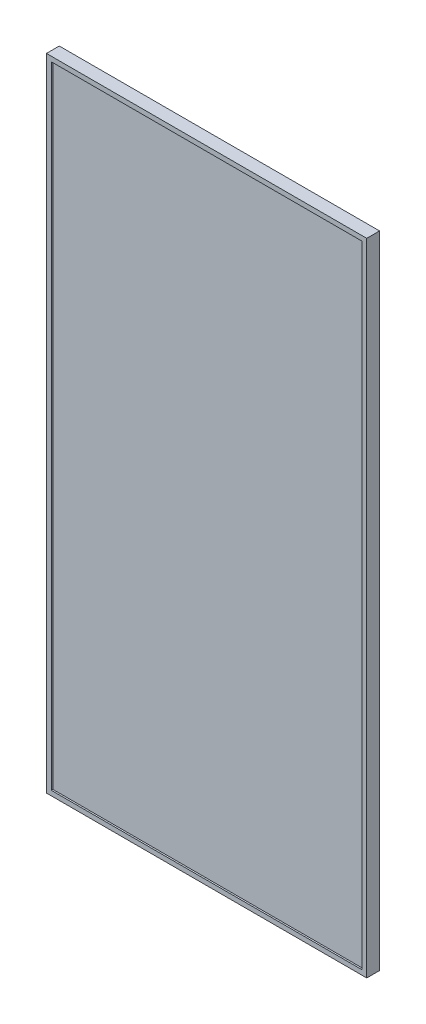
ISO-10303-21;
HEADER;
FILE_DESCRIPTION(('STEP AP214'),'2;1');
FILE_NAME('part.step','',(''),(''),'','','');
FILE_SCHEMA(('AUTOMOTIVE_DESIGN { 1 0 10303 214 1 1 1 1 }'));
ENDSEC;
DATA;
#1=APPLICATION_CONTEXT('core data for automotive mechanical design processes');
#2=APPLICATION_PROTOCOL_DEFINITION('international standard','automotive_design',2000,#1);
#3=PRODUCT_CONTEXT('',#1,'mechanical');
#4=PRODUCT('Part','Part','',(#3));
#5=PRODUCT_RELATED_PRODUCT_CATEGORY('part','',(#4));
#6=PRODUCT_DEFINITION_FORMATION('','',#4);
#7=PRODUCT_DEFINITION_CONTEXT('part definition',#1,'design');
#8=PRODUCT_DEFINITION('design','',#6,#7);
#9=PRODUCT_DEFINITION_SHAPE('','',#8);
#10=(LENGTH_UNIT() NAMED_UNIT(*) SI_UNIT(.MILLI.,.METRE.));
#11=(NAMED_UNIT(*) PLANE_ANGLE_UNIT() SI_UNIT($,.RADIAN.));
#12=(NAMED_UNIT(*) SI_UNIT($,.STERADIAN.) SOLID_ANGLE_UNIT());
#13=UNCERTAINTY_MEASURE_WITH_UNIT(LENGTH_MEASURE(1.E-05),#10,'distance_accuracy_value','');
#14=(GEOMETRIC_REPRESENTATION_CONTEXT(3) GLOBAL_UNCERTAINTY_ASSIGNED_CONTEXT((#13)) GLOBAL_UNIT_ASSIGNED_CONTEXT((#10,
#11,#12)) REPRESENTATION_CONTEXT('',''));
#15=CARTESIAN_POINT('',(0.,0.,0.));
#16=DIRECTION('',(0.,0.,1.));
#17=DIRECTION('',(1.,0.,0.));
#18=AXIS2_PLACEMENT_3D('',#15,#16,#17);
#19=CARTESIAN_POINT('',(470.,-970.,30.));
#20=DIRECTION('',(1.,0.,0.));
#21=DIRECTION('',(0.,0.,-1.));
#22=AXIS2_PLACEMENT_3D('',#19,#20,#21);
#23=PLANE('',#22);
#24=DIRECTION('',(0.,-1.,0.));
#25=VECTOR('',#24,1.);
#26=CARTESIAN_POINT('',(470.,-970.,5.));
#27=LINE('',#26,#25);
#28=CARTESIAN_POINT('',(470.,970.,5.));
#29=VERTEX_POINT('',#28);
#30=CARTESIAN_POINT('',(470.,-970.,5.));
#31=VERTEX_POINT('',#30);
#32=EDGE_CURVE('E63',#29,#31,#27,.T.);
#33=ORIENTED_EDGE('',*,*,#32,.F.);
#34=DIRECTION('',(0.,0.,-1.));
#35=VECTOR('',#34,1.);
#36=CARTESIAN_POINT('',(470.,970.,30.));
#37=LINE('',#36,#35);
#38=CARTESIAN_POINT('',(470.,970.,0.));
#39=VERTEX_POINT('',#38);
#40=EDGE_CURVE('E269',#29,#39,#37,.T.);
#41=ORIENTED_EDGE('',*,*,#40,.T.);
#42=DIRECTION('',(0.,-1.,0.));
#43=VECTOR('',#42,1.);
#44=CARTESIAN_POINT('',(470.,-970.,0.));
#45=LINE('',#44,#43);
#46=CARTESIAN_POINT('',(470.,-970.,0.));
#47=VERTEX_POINT('',#46);
#48=EDGE_CURVE('E252',#39,#47,#45,.T.);
#49=ORIENTED_EDGE('',*,*,#48,.T.);
#50=DIRECTION('',(0.,0.,-1.));
#51=VECTOR('',#50,1.);
#52=CARTESIAN_POINT('',(470.,-970.,30.));
#53=LINE('',#52,#51);
#54=EDGE_CURVE('E268',#31,#47,#53,.T.);
#55=ORIENTED_EDGE('',*,*,#54,.F.);
#56=EDGE_LOOP('',(#33,#41,#49,#55));
#57=FACE_BOUND('',#56,.T.);
#58=ADVANCED_FACE('F40',(#57),#23,.F.);
#59=CARTESIAN_POINT('',(-470.,970.,30.));
#60=DIRECTION('',(0.,1.,0.));
#61=DIRECTION('',(0.,0.,1.));
#62=AXIS2_PLACEMENT_3D('',#59,#60,#61);
#63=PLANE('',#62);
#64=DIRECTION('',(1.,0.,0.));
#65=VECTOR('',#64,1.);
#66=CARTESIAN_POINT('',(-470.,970.,5.));
#67=LINE('',#66,#65);
#68=CARTESIAN_POINT('',(-470.,970.,5.));
#69=VERTEX_POINT('',#68);
#70=EDGE_CURVE('E247',#69,#29,#67,.T.);
#71=ORIENTED_EDGE('',*,*,#70,.F.);
#72=DIRECTION('',(0.,0.,-1.));
#73=VECTOR('',#72,1.);
#74=CARTESIAN_POINT('',(-470.,970.,30.));
#75=LINE('',#74,#73);
#76=CARTESIAN_POINT('',(-470.,970.,0.));
#77=VERTEX_POINT('',#76);
#78=EDGE_CURVE('E273',#69,#77,#75,.T.);
#79=ORIENTED_EDGE('',*,*,#78,.T.);
#80=DIRECTION('',(1.,0.,0.));
#81=VECTOR('',#80,1.);
#82=CARTESIAN_POINT('',(-470.,970.,0.));
#83=LINE('',#82,#81);
#84=EDGE_CURVE('E264',#77,#39,#83,.T.);
#85=ORIENTED_EDGE('',*,*,#84,.T.);
#86=ORIENTED_EDGE('',*,*,#40,.F.);
#87=EDGE_LOOP('',(#71,#79,#85,#86));
#88=FACE_BOUND('',#87,.T.);
#89=ADVANCED_FACE('F353',(#88),#63,.F.);
#90=CARTESIAN_POINT('',(-470.,-970.,30.));
#91=DIRECTION('',(-1.,0.,0.));
#92=DIRECTION('',(0.,0.,1.));
#93=AXIS2_PLACEMENT_3D('',#90,#91,#92);
#94=PLANE('',#93);
#95=DIRECTION('',(0.,1.,0.));
#96=VECTOR('',#95,1.);
#97=CARTESIAN_POINT('',(-470.,-970.,5.));
#98=LINE('',#97,#96);
#99=CARTESIAN_POINT('',(-470.,-970.,5.));
#100=VERTEX_POINT('',#99);
#101=EDGE_CURVE('E244',#100,#69,#98,.T.);
#102=ORIENTED_EDGE('',*,*,#101,.F.);
#103=DIRECTION('',(0.,0.,-1.));
#104=VECTOR('',#103,1.);
#105=CARTESIAN_POINT('',(-470.,-970.,30.));
#106=LINE('',#105,#104);
#107=CARTESIAN_POINT('',(-470.,-970.,0.));
#108=VERTEX_POINT('',#107);
#109=EDGE_CURVE('E276',#100,#108,#106,.T.);
#110=ORIENTED_EDGE('',*,*,#109,.T.);
#111=DIRECTION('',(0.,1.,0.));
#112=VECTOR('',#111,1.);
#113=CARTESIAN_POINT('',(-470.,-970.,0.));
#114=LINE('',#113,#112);
#115=EDGE_CURVE('E260',#108,#77,#114,.T.);
#116=ORIENTED_EDGE('',*,*,#115,.T.);
#117=ORIENTED_EDGE('',*,*,#78,.F.);
#118=EDGE_LOOP('',(#102,#110,#116,#117));
#119=FACE_BOUND('',#118,.T.);
#120=ADVANCED_FACE('F358',(#119),#94,.F.);
#121=CARTESIAN_POINT('',(-470.,-970.,30.));
#122=DIRECTION('',(0.,-1.,0.));
#123=DIRECTION('',(0.,0.,-1.));
#124=AXIS2_PLACEMENT_3D('',#121,#122,#123);
#125=PLANE('',#124);
#126=DIRECTION('',(-1.,0.,0.));
#127=VECTOR('',#126,1.);
#128=CARTESIAN_POINT('',(-470.,-970.,5.));
#129=LINE('',#128,#127);
#130=EDGE_CURVE('E11',#31,#100,#129,.T.);
#131=ORIENTED_EDGE('',*,*,#130,.F.);
#132=ORIENTED_EDGE('',*,*,#54,.T.);
#133=DIRECTION('',(-1.,0.,0.));
#134=VECTOR('',#133,1.);
#135=CARTESIAN_POINT('',(-470.,-970.,0.));
#136=LINE('',#135,#134);
#137=EDGE_CURVE('E256',#47,#108,#136,.T.);
#138=ORIENTED_EDGE('',*,*,#137,.T.);
#139=ORIENTED_EDGE('',*,*,#109,.F.);
#140=EDGE_LOOP('',(#131,#132,#138,#139));
#141=FACE_BOUND('',#140,.T.);
#142=ADVANCED_FACE('F362',(#141),#125,.F.);
#143=CARTESIAN_POINT('',(-500.,1000.,40.));
#144=DIRECTION('',(1.,0.,0.));
#145=DIRECTION('',(0.,1.,0.));
#146=AXIS2_PLACEMENT_3D('',#143,#144,#145);
#147=PLANE('',#146);
#148=DIRECTION('',(0.,-1.,0.));
#149=VECTOR('',#148,1.);
#150=CARTESIAN_POINT('',(-500.,1000.,0.));
#151=LINE('',#150,#149);
#152=CARTESIAN_POINT('',(-500.,1000.,0.));
#153=VERTEX_POINT('',#152);
#154=CARTESIAN_POINT('',(-500.,-1000.,0.));
#155=VERTEX_POINT('',#154);
#156=EDGE_CURVE('E272',#153,#155,#151,.T.);
#157=ORIENTED_EDGE('',*,*,#156,.T.);
#158=DIRECTION('',(0.,0.,-1.));
#159=VECTOR('',#158,1.);
#160=CARTESIAN_POINT('',(-500.,-1000.,40.));
#161=LINE('',#160,#159);
#162=CARTESIAN_POINT('',(-500.,-1000.,40.));
#163=VERTEX_POINT('',#162);
#164=EDGE_CURVE('E49',#163,#155,#161,.T.);
#165=ORIENTED_EDGE('',*,*,#164,.F.);
#166=DIRECTION('',(0.,-1.,0.));
#167=VECTOR('',#166,1.);
#168=CARTESIAN_POINT('',(-500.,1000.,40.));
#169=LINE('',#168,#167);
#170=CARTESIAN_POINT('',(-500.,1000.,40.));
#171=VERTEX_POINT('',#170);
#172=EDGE_CURVE('E281',#171,#163,#169,.T.);
#173=ORIENTED_EDGE('',*,*,#172,.F.);
#174=DIRECTION('',(0.,0.,-1.));
#175=VECTOR('',#174,1.);
#176=CARTESIAN_POINT('',(-500.,1000.,40.));
#177=LINE('',#176,#175);
#178=EDGE_CURVE('E295',#171,#153,#177,.T.);
#179=ORIENTED_EDGE('',*,*,#178,.T.);
#180=EDGE_LOOP('',(#157,#165,#173,#179));
#181=FACE_BOUND('',#180,.T.);
#182=ADVANCED_FACE('F42',(#181),#147,.F.);
#183=CARTESIAN_POINT('',(500.,-1000.,40.));
#184=DIRECTION('',(0.,1.,0.));
#185=DIRECTION('',(-1.,0.,0.));
#186=AXIS2_PLACEMENT_3D('',#183,#184,#185);
#187=PLANE('',#186);
#188=DIRECTION('',(1.,0.,0.));
#189=VECTOR('',#188,1.);
#190=CARTESIAN_POINT('',(500.,-1000.,0.));
#191=LINE('',#190,#189);
#192=CARTESIAN_POINT('',(500.,-1000.,0.));
#193=VERTEX_POINT('',#192);
#194=EDGE_CURVE('E299',#155,#193,#191,.T.);
#195=ORIENTED_EDGE('',*,*,#194,.T.);
#196=DIRECTION('',(0.,0.,-1.));
#197=VECTOR('',#196,1.);
#198=CARTESIAN_POINT('',(500.,-1000.,40.));
#199=LINE('',#198,#197);
#200=CARTESIAN_POINT('',(500.,-1000.,40.));
#201=VERTEX_POINT('',#200);
#202=EDGE_CURVE('E314',#201,#193,#199,.T.);
#203=ORIENTED_EDGE('',*,*,#202,.F.);
#204=DIRECTION('',(1.,0.,0.));
#205=VECTOR('',#204,1.);
#206=CARTESIAN_POINT('',(500.,-1000.,40.));
#207=LINE('',#206,#205);
#208=EDGE_CURVE('E285',#163,#201,#207,.T.);
#209=ORIENTED_EDGE('',*,*,#208,.F.);
#210=ORIENTED_EDGE('',*,*,#164,.T.);
#211=EDGE_LOOP('',(#195,#203,#209,#210));
#212=FACE_BOUND('',#211,.T.);
#213=ADVANCED_FACE('F321',(#212),#187,.F.);
#214=CARTESIAN_POINT('',(500.,1000.,40.));
#215=DIRECTION('',(-1.,0.,0.));
#216=DIRECTION('',(0.,-1.,0.));
#217=AXIS2_PLACEMENT_3D('',#214,#215,#216);
#218=PLANE('',#217);
#219=DIRECTION('',(0.,1.,0.));
#220=VECTOR('',#219,1.);
#221=CARTESIAN_POINT('',(500.,1000.,0.));
#222=LINE('',#221,#220);
#223=CARTESIAN_POINT('',(500.,1000.,0.));
#224=VERTEX_POINT('',#223);
#225=EDGE_CURVE('E302',#193,#224,#222,.T.);
#226=ORIENTED_EDGE('',*,*,#225,.T.);
#227=DIRECTION('',(0.,0.,-1.));
#228=VECTOR('',#227,1.);
#229=CARTESIAN_POINT('',(500.,1000.,40.));
#230=LINE('',#229,#228);
#231=CARTESIAN_POINT('',(500.,1000.,40.));
#232=VERTEX_POINT('',#231);
#233=EDGE_CURVE('E310',#232,#224,#230,.T.);
#234=ORIENTED_EDGE('',*,*,#233,.F.);
#235=DIRECTION('',(0.,1.,0.));
#236=VECTOR('',#235,1.);
#237=CARTESIAN_POINT('',(500.,1000.,40.));
#238=LINE('',#237,#236);
#239=EDGE_CURVE('E289',#201,#232,#238,.T.);
#240=ORIENTED_EDGE('',*,*,#239,.F.);
#241=ORIENTED_EDGE('',*,*,#202,.T.);
#242=EDGE_LOOP('',(#226,#234,#240,#241));
#243=FACE_BOUND('',#242,.T.);
#244=ADVANCED_FACE('F333',(#243),#218,.F.);
#245=CARTESIAN_POINT('',(500.,1000.,40.));
#246=DIRECTION('',(0.,-1.,0.));
#247=DIRECTION('',(1.,0.,0.));
#248=AXIS2_PLACEMENT_3D('',#245,#246,#247);
#249=PLANE('',#248);
#250=DIRECTION('',(-1.,0.,0.));
#251=VECTOR('',#250,1.);
#252=CARTESIAN_POINT('',(500.,1000.,0.));
#253=LINE('',#252,#251);
#254=EDGE_CURVE('E286',#224,#153,#253,.T.);
#255=ORIENTED_EDGE('',*,*,#254,.T.);
#256=ORIENTED_EDGE('',*,*,#178,.F.);
#257=DIRECTION('',(-1.,0.,0.));
#258=VECTOR('',#257,1.);
#259=CARTESIAN_POINT('',(500.,1000.,40.));
#260=LINE('',#259,#258);
#261=EDGE_CURVE('E292',#232,#171,#260,.T.);
#262=ORIENTED_EDGE('',*,*,#261,.F.);
#263=ORIENTED_EDGE('',*,*,#233,.T.);
#264=EDGE_LOOP('',(#255,#256,#262,#263));
#265=FACE_BOUND('',#264,.T.);
#266=ADVANCED_FACE('F337',(#265),#249,.F.);
#267=CARTESIAN_POINT('',(0.,0.,40.));
#268=DIRECTION('',(0.,0.,-1.));
#269=DIRECTION('',(-1.,0.,0.));
#270=AXIS2_PLACEMENT_3D('',#267,#268,#269);
#271=PLANE('',#270);
#272=DIRECTION('',(-1.,0.,0.));
#273=VECTOR('',#272,1.);
#274=CARTESIAN_POINT('',(-485.,985.,40.));
#275=LINE('',#274,#273);
#276=CARTESIAN_POINT('',(485.,985.,40.));
#277=VERTEX_POINT('',#276);
#278=CARTESIAN_POINT('',(-485.,985.,40.));
#279=VERTEX_POINT('',#278);
#280=EDGE_CURVE('E189',#277,#279,#275,.T.);
#281=ORIENTED_EDGE('',*,*,#280,.F.);
#282=DIRECTION('',(0.,1.,0.));
#283=VECTOR('',#282,1.);
#284=CARTESIAN_POINT('',(485.,-985.,40.));
#285=LINE('',#284,#283);
#286=CARTESIAN_POINT('',(485.,-985.,40.));
#287=VERTEX_POINT('',#286);
#288=EDGE_CURVE('E56',#287,#277,#285,.T.);
#289=ORIENTED_EDGE('',*,*,#288,.F.);
#290=DIRECTION('',(1.,0.,0.));
#291=VECTOR('',#290,1.);
#292=CARTESIAN_POINT('',(-485.,-985.,40.));
#293=LINE('',#292,#291);
#294=CARTESIAN_POINT('',(-485.,-985.,40.));
#295=VERTEX_POINT('',#294);
#296=EDGE_CURVE('E176',#295,#287,#293,.T.);
#297=ORIENTED_EDGE('',*,*,#296,.F.);
#298=DIRECTION('',(0.,-1.,0.));
#299=VECTOR('',#298,1.);
#300=CARTESIAN_POINT('',(-485.,-985.,40.));
#301=LINE('',#300,#299);
#302=EDGE_CURVE('E180',#279,#295,#301,.T.);
#303=ORIENTED_EDGE('',*,*,#302,.F.);
#304=EDGE_LOOP('',(#281,#289,#297,#303));
#305=FACE_BOUND('',#304,.T.);
#306=ORIENTED_EDGE('',*,*,#172,.T.);
#307=ORIENTED_EDGE('',*,*,#208,.T.);
#308=ORIENTED_EDGE('',*,*,#239,.T.);
#309=ORIENTED_EDGE('',*,*,#261,.T.);
#310=EDGE_LOOP('',(#306,#307,#308,#309));
#311=FACE_BOUND('',#310,.T.);
#312=ADVANCED_FACE('F339',(#305,#311),#271,.F.);
#313=CARTESIAN_POINT('',(0.,0.,0.));
#314=DIRECTION('',(0.,0.,-1.));
#315=DIRECTION('',(-1.,0.,0.));
#316=AXIS2_PLACEMENT_3D('',#313,#314,#315);
#317=PLANE('',#316);
#318=ORIENTED_EDGE('',*,*,#48,.F.);
#319=ORIENTED_EDGE('',*,*,#84,.F.);
#320=ORIENTED_EDGE('',*,*,#115,.F.);
#321=ORIENTED_EDGE('',*,*,#137,.F.);
#322=EDGE_LOOP('',(#318,#319,#320,#321));
#323=FACE_BOUND('',#322,.T.);
#324=ORIENTED_EDGE('',*,*,#156,.F.);
#325=ORIENTED_EDGE('',*,*,#254,.F.);
#326=ORIENTED_EDGE('',*,*,#225,.F.);
#327=ORIENTED_EDGE('',*,*,#194,.F.);
#328=EDGE_LOOP('',(#324,#325,#326,#327));
#329=FACE_BOUND('',#328,.T.);
#330=ADVANCED_FACE('F329',(#323,#329),#317,.T.);
#331=CARTESIAN_POINT('',(495.,-995.,5.));
#332=DIRECTION('',(0.,0.,1.));
#333=DIRECTION('',(1.,0.,0.));
#334=AXIS2_PLACEMENT_3D('',#331,#332,#333);
#335=PLANE('',#334);
#336=DIRECTION('',(-1.,0.,0.));
#337=VECTOR('',#336,1.);
#338=CARTESIAN_POINT('',(495.,-995.,5.));
#339=LINE('',#338,#337);
#340=CARTESIAN_POINT('',(495.,-995.,5.));
#341=VERTEX_POINT('',#340);
#342=CARTESIAN_POINT('',(-495.,-995.,5.));
#343=VERTEX_POINT('',#342);
#344=EDGE_CURVE('E241',#341,#343,#339,.T.);
#345=ORIENTED_EDGE('',*,*,#344,.F.);
#346=DIRECTION('',(0.,1.,0.));
#347=VECTOR('',#346,1.);
#348=CARTESIAN_POINT('',(495.,-995.,5.));
#349=LINE('',#348,#347);
#350=CARTESIAN_POINT('',(495.,995.,5.));
#351=VERTEX_POINT('',#350);
#352=EDGE_CURVE('E223',#341,#351,#349,.T.);
#353=ORIENTED_EDGE('',*,*,#352,.T.);
#354=DIRECTION('',(-1.,0.,0.));
#355=VECTOR('',#354,1.);
#356=CARTESIAN_POINT('',(495.,995.,5.));
#357=LINE('',#356,#355);
#358=CARTESIAN_POINT('',(-495.,995.,5.));
#359=VERTEX_POINT('',#358);
#360=EDGE_CURVE('E238',#351,#359,#357,.T.);
#361=ORIENTED_EDGE('',*,*,#360,.T.);
#362=DIRECTION('',(0.,1.,0.));
#363=VECTOR('',#362,1.);
#364=CARTESIAN_POINT('',(-495.,-995.,5.));
#365=LINE('',#364,#363);
#366=EDGE_CURVE('E207',#343,#359,#365,.T.);
#367=ORIENTED_EDGE('',*,*,#366,.F.);
#368=EDGE_LOOP('',(#345,#353,#361,#367));
#369=FACE_BOUND('',#368,.T.);
#370=ORIENTED_EDGE('',*,*,#32,.T.);
#371=ORIENTED_EDGE('',*,*,#130,.T.);
#372=ORIENTED_EDGE('',*,*,#101,.T.);
#373=ORIENTED_EDGE('',*,*,#70,.T.);
#374=EDGE_LOOP('',(#370,#371,#372,#373));
#375=FACE_BOUND('',#374,.T.);
#376=ADVANCED_FACE('F347',(#369,#375),#335,.T.);
#377=CARTESIAN_POINT('',(495.,-995.,5.));
#378=DIRECTION('',(0.,1.,0.));
#379=DIRECTION('',(0.,0.,1.));
#380=AXIS2_PLACEMENT_3D('',#377,#378,#379);
#381=PLANE('',#380);
#382=DIRECTION('',(-1.,0.,0.));
#383=VECTOR('',#382,1.);
#384=CARTESIAN_POINT('',(495.,-995.,30.));
#385=LINE('',#384,#383);
#386=CARTESIAN_POINT('',(495.,-995.,30.));
#387=VERTEX_POINT('',#386);
#388=CARTESIAN_POINT('',(-495.,-995.,30.));
#389=VERTEX_POINT('',#388);
#390=EDGE_CURVE('E232',#387,#389,#385,.T.);
#391=ORIENTED_EDGE('',*,*,#390,.F.);
#392=DIRECTION('',(0.,0.,-1.));
#393=VECTOR('',#392,1.);
#394=CARTESIAN_POINT('',(495.,-995.,5.));
#395=LINE('',#394,#393);
#396=EDGE_CURVE('E219',#387,#341,#395,.T.);
#397=ORIENTED_EDGE('',*,*,#396,.T.);
#398=ORIENTED_EDGE('',*,*,#344,.T.);
#399=DIRECTION('',(0.,0.,-1.));
#400=VECTOR('',#399,1.);
#401=CARTESIAN_POINT('',(-495.,-995.,5.));
#402=LINE('',#401,#400);
#403=EDGE_CURVE('E198',#389,#343,#402,.T.);
#404=ORIENTED_EDGE('',*,*,#403,.F.);
#405=EDGE_LOOP('',(#391,#397,#398,#404));
#406=FACE_BOUND('',#405,.T.);
#407=ADVANCED_FACE('F374',(#406),#381,.T.);
#408=CARTESIAN_POINT('',(495.,995.,5.));
#409=DIRECTION('',(0.,-1.,0.));
#410=DIRECTION('',(0.,0.,-1.));
#411=AXIS2_PLACEMENT_3D('',#408,#409,#410);
#412=PLANE('',#411);
#413=ORIENTED_EDGE('',*,*,#360,.F.);
#414=DIRECTION('',(0.,0.,1.));
#415=VECTOR('',#414,1.);
#416=CARTESIAN_POINT('',(495.,995.,5.));
#417=LINE('',#416,#415);
#418=CARTESIAN_POINT('',(495.,995.,30.));
#419=VERTEX_POINT('',#418);
#420=EDGE_CURVE('E226',#351,#419,#417,.T.);
#421=ORIENTED_EDGE('',*,*,#420,.T.);
#422=DIRECTION('',(-1.,0.,0.));
#423=VECTOR('',#422,1.);
#424=CARTESIAN_POINT('',(495.,995.,30.));
#425=LINE('',#424,#423);
#426=CARTESIAN_POINT('',(-495.,995.,30.));
#427=VERTEX_POINT('',#426);
#428=EDGE_CURVE('E235',#419,#427,#425,.T.);
#429=ORIENTED_EDGE('',*,*,#428,.T.);
#430=DIRECTION('',(0.,0.,1.));
#431=VECTOR('',#430,1.);
#432=CARTESIAN_POINT('',(-495.,995.,5.));
#433=LINE('',#432,#431);
#434=EDGE_CURVE('E211',#359,#427,#433,.T.);
#435=ORIENTED_EDGE('',*,*,#434,.F.);
#436=EDGE_LOOP('',(#413,#421,#429,#435));
#437=FACE_BOUND('',#436,.T.);
#438=ADVANCED_FACE('F377',(#437),#412,.T.);
#439=CARTESIAN_POINT('',(495.,0.,0.));
#440=DIRECTION('',(-1.,0.,0.));
#441=DIRECTION('',(0.,0.,1.));
#442=AXIS2_PLACEMENT_3D('',#439,#440,#441);
#443=PLANE('',#442);
#444=ORIENTED_EDGE('',*,*,#396,.F.);
#445=DIRECTION('',(0.,-1.,0.));
#446=VECTOR('',#445,1.);
#447=CARTESIAN_POINT('',(495.,-995.,30.));
#448=LINE('',#447,#446);
#449=EDGE_CURVE('E229',#419,#387,#448,.T.);
#450=ORIENTED_EDGE('',*,*,#449,.F.);
#451=ORIENTED_EDGE('',*,*,#420,.F.);
#452=ORIENTED_EDGE('',*,*,#352,.F.);
#453=EDGE_LOOP('',(#444,#450,#451,#452));
#454=FACE_BOUND('',#453,.T.);
#455=ADVANCED_FACE('F384',(#454),#443,.T.);
#456=CARTESIAN_POINT('',(-495.,0.,0.));
#457=DIRECTION('',(-1.,0.,0.));
#458=DIRECTION('',(0.,0.,1.));
#459=AXIS2_PLACEMENT_3D('',#456,#457,#458);
#460=PLANE('',#459);
#461=ORIENTED_EDGE('',*,*,#403,.T.);
#462=ORIENTED_EDGE('',*,*,#366,.T.);
#463=ORIENTED_EDGE('',*,*,#434,.T.);
#464=DIRECTION('',(0.,-1.,0.));
#465=VECTOR('',#464,1.);
#466=CARTESIAN_POINT('',(-495.,-995.,30.));
#467=LINE('',#466,#465);
#468=EDGE_CURVE('E215',#427,#389,#467,.T.);
#469=ORIENTED_EDGE('',*,*,#468,.T.);
#470=EDGE_LOOP('',(#461,#462,#463,#469));
#471=FACE_BOUND('',#470,.T.);
#472=ADVANCED_FACE('F372',(#471),#460,.F.);
#473=CARTESIAN_POINT('',(0.,0.,30.));
#474=DIRECTION('',(0.,0.,-1.));
#475=DIRECTION('',(-1.,0.,0.));
#476=AXIS2_PLACEMENT_3D('',#473,#474,#475);
#477=PLANE('',#476);
#478=ORIENTED_EDGE('',*,*,#428,.F.);
#479=ORIENTED_EDGE('',*,*,#449,.T.);
#480=ORIENTED_EDGE('',*,*,#390,.T.);
#481=ORIENTED_EDGE('',*,*,#468,.F.);
#482=EDGE_LOOP('',(#478,#479,#480,#481));
#483=FACE_BOUND('',#482,.T.);
#484=ADVANCED_FACE('F369',(#483),#477,.T.);
#485=CARTESIAN_POINT('',(485.,-985.,35.));
#486=DIRECTION('',(1.,0.,0.));
#487=DIRECTION('',(0.,0.,-1.));
#488=AXIS2_PLACEMENT_3D('',#485,#486,#487);
#489=PLANE('',#488);
#490=ORIENTED_EDGE('',*,*,#288,.T.);
#491=DIRECTION('',(0.,0.,1.));
#492=VECTOR('',#491,1.);
#493=CARTESIAN_POINT('',(485.,985.,35.));
#494=LINE('',#493,#492);
#495=CARTESIAN_POINT('',(485.,985.,35.));
#496=VERTEX_POINT('',#495);
#497=EDGE_CURVE('E151',#496,#277,#494,.T.);
#498=ORIENTED_EDGE('',*,*,#497,.F.);
#499=DIRECTION('',(0.,1.,0.));
#500=VECTOR('',#499,1.);
#501=CARTESIAN_POINT('',(485.,-985.,35.));
#502=LINE('',#501,#500);
#503=CARTESIAN_POINT('',(485.,-985.,35.));
#504=VERTEX_POINT('',#503);
#505=EDGE_CURVE('E155',#504,#496,#502,.T.);
#506=ORIENTED_EDGE('',*,*,#505,.F.);
#507=DIRECTION('',(0.,0.,1.));
#508=VECTOR('',#507,1.);
#509=CARTESIAN_POINT('',(485.,-985.,35.));
#510=LINE('',#509,#508);
#511=EDGE_CURVE('E195',#504,#287,#510,.T.);
#512=ORIENTED_EDGE('',*,*,#511,.T.);
#513=EDGE_LOOP('',(#490,#498,#506,#512));
#514=FACE_BOUND('',#513,.T.);
#515=ADVANCED_FACE('F153',(#514),#489,.F.);
#516=CARTESIAN_POINT('',(-485.,-985.,35.));
#517=DIRECTION('',(0.,-1.,0.));
#518=DIRECTION('',(0.,0.,-1.));
#519=AXIS2_PLACEMENT_3D('',#516,#517,#518);
#520=PLANE('',#519);
#521=ORIENTED_EDGE('',*,*,#296,.T.);
#522=ORIENTED_EDGE('',*,*,#511,.F.);
#523=DIRECTION('',(1.,0.,0.));
#524=VECTOR('',#523,1.);
#525=CARTESIAN_POINT('',(-485.,-985.,35.));
#526=LINE('',#525,#524);
#527=CARTESIAN_POINT('',(-485.,-985.,35.));
#528=VERTEX_POINT('',#527);
#529=EDGE_CURVE('E162',#528,#504,#526,.T.);
#530=ORIENTED_EDGE('',*,*,#529,.F.);
#531=DIRECTION('',(0.,0.,1.));
#532=VECTOR('',#531,1.);
#533=CARTESIAN_POINT('',(-485.,-985.,35.));
#534=LINE('',#533,#532);
#535=EDGE_CURVE('E199',#528,#295,#534,.T.);
#536=ORIENTED_EDGE('',*,*,#535,.T.);
#537=EDGE_LOOP('',(#521,#522,#530,#536));
#538=FACE_BOUND('',#537,.T.);
#539=ADVANCED_FACE('F394',(#538),#520,.F.);
#540=CARTESIAN_POINT('',(-485.,-985.,35.));
#541=DIRECTION('',(-1.,0.,0.));
#542=DIRECTION('',(0.,0.,1.));
#543=AXIS2_PLACEMENT_3D('',#540,#541,#542);
#544=PLANE('',#543);
#545=ORIENTED_EDGE('',*,*,#302,.T.);
#546=ORIENTED_EDGE('',*,*,#535,.F.);
#547=DIRECTION('',(0.,-1.,0.));
#548=VECTOR('',#547,1.);
#549=CARTESIAN_POINT('',(-485.,-985.,35.));
#550=LINE('',#549,#548);
#551=CARTESIAN_POINT('',(-485.,985.,35.));
#552=VERTEX_POINT('',#551);
#553=EDGE_CURVE('E171',#552,#528,#550,.T.);
#554=ORIENTED_EDGE('',*,*,#553,.F.);
#555=DIRECTION('',(0.,0.,1.));
#556=VECTOR('',#555,1.);
#557=CARTESIAN_POINT('',(-485.,985.,35.));
#558=LINE('',#557,#556);
#559=EDGE_CURVE('E161',#552,#279,#558,.T.);
#560=ORIENTED_EDGE('',*,*,#559,.T.);
#561=EDGE_LOOP('',(#545,#546,#554,#560));
#562=FACE_BOUND('',#561,.T.);
#563=ADVANCED_FACE('F397',(#562),#544,.F.);
#564=CARTESIAN_POINT('',(-485.,985.,35.));
#565=DIRECTION('',(0.,1.,0.));
#566=DIRECTION('',(0.,0.,1.));
#567=AXIS2_PLACEMENT_3D('',#564,#565,#566);
#568=PLANE('',#567);
#569=ORIENTED_EDGE('',*,*,#280,.T.);
#570=ORIENTED_EDGE('',*,*,#559,.F.);
#571=DIRECTION('',(-1.,0.,0.));
#572=VECTOR('',#571,1.);
#573=CARTESIAN_POINT('',(-485.,985.,35.));
#574=LINE('',#573,#572);
#575=EDGE_CURVE('E165',#496,#552,#574,.T.);
#576=ORIENTED_EDGE('',*,*,#575,.F.);
#577=ORIENTED_EDGE('',*,*,#497,.T.);
#578=EDGE_LOOP('',(#569,#570,#576,#577));
#579=FACE_BOUND('',#578,.T.);
#580=ADVANCED_FACE('F166',(#579),#568,.F.);
#581=CARTESIAN_POINT('',(0.,0.,35.));
#582=DIRECTION('',(0.,0.,-1.));
#583=DIRECTION('',(-1.,0.,0.));
#584=AXIS2_PLACEMENT_3D('',#581,#582,#583);
#585=PLANE('',#584);
#586=ORIENTED_EDGE('',*,*,#505,.T.);
#587=ORIENTED_EDGE('',*,*,#575,.T.);
#588=ORIENTED_EDGE('',*,*,#553,.T.);
#589=ORIENTED_EDGE('',*,*,#529,.T.);
#590=EDGE_LOOP('',(#586,#587,#588,#589));
#591=FACE_BOUND('',#590,.T.);
#592=ADVANCED_FACE('F173',(#591),#585,.F.);
#593=CLOSED_SHELL('',(#58,#89,#120,#142,#182,#213,#244,#266,#312,#330,#376,#407,#438,#455,#472,
#484,#515,#539,#563,#580,#592));
#594=MANIFOLD_SOLID_BREP('B2',#593);
#595=ADVANCED_BREP_SHAPE_REPRESENTATION('',(#18,#594),#14);
#596=SHAPE_DEFINITION_REPRESENTATION(#9,#595);
ENDSEC;
END-ISO-10303-21;
